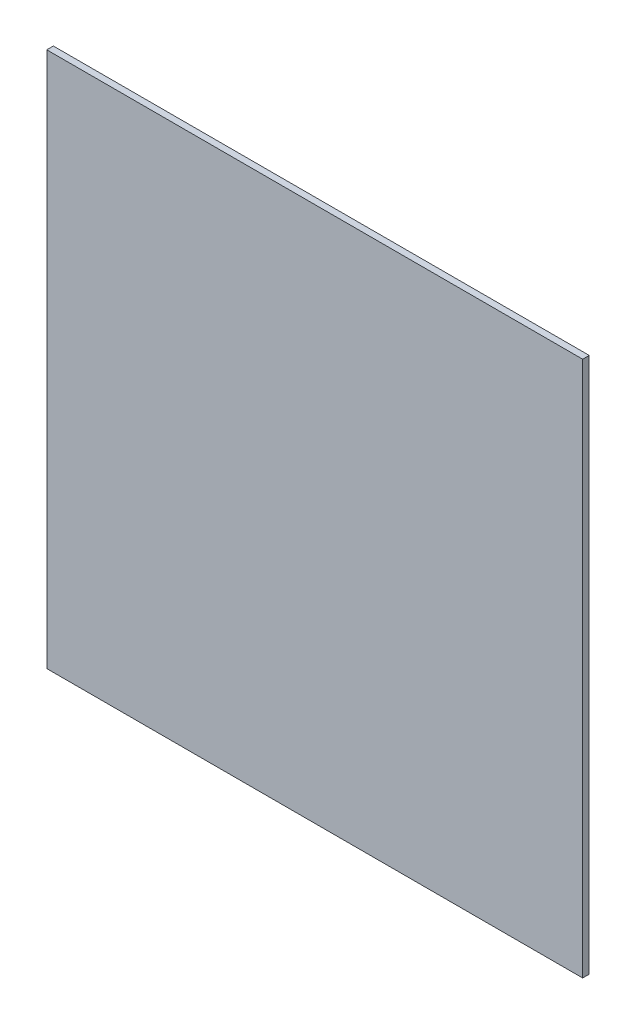
ISO-10303-21;
HEADER;
FILE_DESCRIPTION(('STEP AP214'),'2;1');
FILE_NAME('part.step','',(''),(''),'','','');
FILE_SCHEMA(('AUTOMOTIVE_DESIGN { 1 0 10303 214 1 1 1 1 }'));
ENDSEC;
DATA;
#1=APPLICATION_CONTEXT('core data for automotive mechanical design processes');
#2=APPLICATION_PROTOCOL_DEFINITION('international standard','automotive_design',2000,#1);
#3=PRODUCT_CONTEXT('',#1,'mechanical');
#4=PRODUCT('Part','Part','',(#3));
#5=PRODUCT_RELATED_PRODUCT_CATEGORY('part','',(#4));
#6=PRODUCT_DEFINITION_FORMATION('','',#4);
#7=PRODUCT_DEFINITION_CONTEXT('part definition',#1,'design');
#8=PRODUCT_DEFINITION('design','',#6,#7);
#9=PRODUCT_DEFINITION_SHAPE('','',#8);
#10=(LENGTH_UNIT() NAMED_UNIT(*) SI_UNIT(.MILLI.,.METRE.));
#11=(NAMED_UNIT(*) PLANE_ANGLE_UNIT() SI_UNIT($,.RADIAN.));
#12=(NAMED_UNIT(*) SI_UNIT($,.STERADIAN.) SOLID_ANGLE_UNIT());
#13=UNCERTAINTY_MEASURE_WITH_UNIT(LENGTH_MEASURE(1.E-05),#10,'distance_accuracy_value','');
#14=(GEOMETRIC_REPRESENTATION_CONTEXT(3) GLOBAL_UNCERTAINTY_ASSIGNED_CONTEXT((#13)) GLOBAL_UNIT_ASSIGNED_CONTEXT((#10,
#11,#12)) REPRESENTATION_CONTEXT('',''));
#15=CARTESIAN_POINT('',(0.,0.,0.));
#16=DIRECTION('',(0.,0.,1.));
#17=DIRECTION('',(1.,0.,0.));
#18=AXIS2_PLACEMENT_3D('',#15,#16,#17);
#19=CARTESIAN_POINT('',(0.,0.,8.73125));
#20=DIRECTION('',(1.,0.,0.));
#21=DIRECTION('',(0.,0.,-1.));
#22=AXIS2_PLACEMENT_3D('',#19,#20,#21);
#23=PLANE('',#22);
#24=DIRECTION('',(0.,-1.,0.));
#25=VECTOR('',#24,1.);
#26=CARTESIAN_POINT('',(0.,0.,0.));
#27=LINE('',#26,#25);
#28=CARTESIAN_POINT('',(0.,711.2,0.));
#29=VERTEX_POINT('',#28);
#30=CARTESIAN_POINT('',(0.,0.,0.));
#31=VERTEX_POINT('',#30);
#32=EDGE_CURVE('E97',#29,#31,#27,.T.);
#33=ORIENTED_EDGE('',*,*,#32,.T.);
#34=DIRECTION('',(0.,0.,-1.));
#35=VECTOR('',#34,1.);
#36=CARTESIAN_POINT('',(0.,0.,8.73125));
#37=LINE('',#36,#35);
#38=CARTESIAN_POINT('',(0.,0.,8.73125));
#39=VERTEX_POINT('',#38);
#40=EDGE_CURVE('E11',#39,#31,#37,.T.);
#41=ORIENTED_EDGE('',*,*,#40,.F.);
#42=DIRECTION('',(0.,-1.,0.));
#43=VECTOR('',#42,1.);
#44=CARTESIAN_POINT('',(0.,0.,8.73125));
#45=LINE('',#44,#43);
#46=CARTESIAN_POINT('',(0.,711.2,8.73125));
#47=VERTEX_POINT('',#46);
#48=EDGE_CURVE('E85',#47,#39,#45,.T.);
#49=ORIENTED_EDGE('',*,*,#48,.F.);
#50=DIRECTION('',(0.,0.,-1.));
#51=VECTOR('',#50,1.);
#52=CARTESIAN_POINT('',(0.,711.2,8.73125));
#53=LINE('',#52,#51);
#54=EDGE_CURVE('E93',#47,#29,#53,.T.);
#55=ORIENTED_EDGE('',*,*,#54,.T.);
#56=EDGE_LOOP('',(#33,#41,#49,#55));
#57=FACE_BOUND('',#56,.T.);
#58=ADVANCED_FACE('F34',(#57),#23,.F.);
#59=CARTESIAN_POINT('',(0.,0.,8.73125));
#60=DIRECTION('',(0.,1.,0.));
#61=DIRECTION('',(0.,0.,1.));
#62=AXIS2_PLACEMENT_3D('',#59,#60,#61);
#63=PLANE('',#62);
#64=DIRECTION('',(1.,0.,0.));
#65=VECTOR('',#64,1.);
#66=CARTESIAN_POINT('',(0.,0.,0.));
#67=LINE('',#66,#65);
#68=CARTESIAN_POINT('',(711.2,0.,0.));
#69=VERTEX_POINT('',#68);
#70=EDGE_CURVE('E89',#31,#69,#67,.T.);
#71=ORIENTED_EDGE('',*,*,#70,.T.);
#72=DIRECTION('',(0.,0.,-1.));
#73=VECTOR('',#72,1.);
#74=CARTESIAN_POINT('',(711.2,0.,8.73125));
#75=LINE('',#74,#73);
#76=CARTESIAN_POINT('',(711.2,0.,8.73125));
#77=VERTEX_POINT('',#76);
#78=EDGE_CURVE('E42',#77,#69,#75,.T.);
#79=ORIENTED_EDGE('',*,*,#78,.F.);
#80=DIRECTION('',(1.,0.,0.));
#81=VECTOR('',#80,1.);
#82=CARTESIAN_POINT('',(0.,0.,8.73125));
#83=LINE('',#82,#81);
#84=EDGE_CURVE('E80',#39,#77,#83,.T.);
#85=ORIENTED_EDGE('',*,*,#84,.F.);
#86=ORIENTED_EDGE('',*,*,#40,.T.);
#87=EDGE_LOOP('',(#71,#79,#85,#86));
#88=FACE_BOUND('',#87,.T.);
#89=ADVANCED_FACE('F88',(#88),#63,.F.);
#90=CARTESIAN_POINT('',(711.2,0.,8.73125));
#91=DIRECTION('',(-1.,0.,0.));
#92=DIRECTION('',(0.,0.,1.));
#93=AXIS2_PLACEMENT_3D('',#90,#91,#92);
#94=PLANE('',#93);
#95=DIRECTION('',(0.,1.,0.));
#96=VECTOR('',#95,1.);
#97=CARTESIAN_POINT('',(711.2,0.,0.));
#98=LINE('',#97,#96);
#99=CARTESIAN_POINT('',(711.2,711.2,0.));
#100=VERTEX_POINT('',#99);
#101=EDGE_CURVE('E67',#69,#100,#98,.T.);
#102=ORIENTED_EDGE('',*,*,#101,.T.);
#103=DIRECTION('',(0.,0.,-1.));
#104=VECTOR('',#103,1.);
#105=CARTESIAN_POINT('',(711.2,711.2,8.73125));
#106=LINE('',#105,#104);
#107=CARTESIAN_POINT('',(711.2,711.2,8.73125));
#108=VERTEX_POINT('',#107);
#109=EDGE_CURVE('E90',#108,#100,#106,.T.);
#110=ORIENTED_EDGE('',*,*,#109,.F.);
#111=DIRECTION('',(0.,1.,0.));
#112=VECTOR('',#111,1.);
#113=CARTESIAN_POINT('',(711.2,0.,8.73125));
#114=LINE('',#113,#112);
#115=EDGE_CURVE('E83',#77,#108,#114,.T.);
#116=ORIENTED_EDGE('',*,*,#115,.F.);
#117=ORIENTED_EDGE('',*,*,#78,.T.);
#118=EDGE_LOOP('',(#102,#110,#116,#117));
#119=FACE_BOUND('',#118,.T.);
#120=ADVANCED_FACE('F91',(#119),#94,.F.);
#121=CARTESIAN_POINT('',(0.,711.2,8.73125));
#122=DIRECTION('',(0.,-1.,0.));
#123=DIRECTION('',(0.,0.,-1.));
#124=AXIS2_PLACEMENT_3D('',#121,#122,#123);
#125=PLANE('',#124);
#126=DIRECTION('',(-1.,0.,0.));
#127=VECTOR('',#126,1.);
#128=CARTESIAN_POINT('',(0.,711.2,0.));
#129=LINE('',#128,#127);
#130=EDGE_CURVE('E73',#100,#29,#129,.T.);
#131=ORIENTED_EDGE('',*,*,#130,.T.);
#132=ORIENTED_EDGE('',*,*,#54,.F.);
#133=DIRECTION('',(-1.,0.,0.));
#134=VECTOR('',#133,1.);
#135=CARTESIAN_POINT('',(0.,711.2,8.73125));
#136=LINE('',#135,#134);
#137=EDGE_CURVE('E50',#108,#47,#136,.T.);
#138=ORIENTED_EDGE('',*,*,#137,.F.);
#139=ORIENTED_EDGE('',*,*,#109,.T.);
#140=EDGE_LOOP('',(#131,#132,#138,#139));
#141=FACE_BOUND('',#140,.T.);
#142=ADVANCED_FACE('F104',(#141),#125,.F.);
#143=CARTESIAN_POINT('',(0.,0.,8.73125));
#144=DIRECTION('',(0.,0.,-1.));
#145=DIRECTION('',(-1.,0.,0.));
#146=AXIS2_PLACEMENT_3D('',#143,#144,#145);
#147=PLANE('',#146);
#148=ORIENTED_EDGE('',*,*,#48,.T.);
#149=ORIENTED_EDGE('',*,*,#84,.T.);
#150=ORIENTED_EDGE('',*,*,#115,.T.);
#151=ORIENTED_EDGE('',*,*,#137,.T.);
#152=EDGE_LOOP('',(#148,#149,#150,#151));
#153=FACE_BOUND('',#152,.T.);
#154=ADVANCED_FACE('F81',(#153),#147,.F.);
#155=CARTESIAN_POINT('',(0.,0.,0.));
#156=DIRECTION('',(0.,0.,-1.));
#157=DIRECTION('',(-1.,0.,0.));
#158=AXIS2_PLACEMENT_3D('',#155,#156,#157);
#159=PLANE('',#158);
#160=ORIENTED_EDGE('',*,*,#32,.F.);
#161=ORIENTED_EDGE('',*,*,#130,.F.);
#162=ORIENTED_EDGE('',*,*,#101,.F.);
#163=ORIENTED_EDGE('',*,*,#70,.F.);
#164=EDGE_LOOP('',(#160,#161,#162,#163));
#165=FACE_BOUND('',#164,.T.);
#166=ADVANCED_FACE('F107',(#165),#159,.T.);
#167=CLOSED_SHELL('',(#58,#89,#120,#142,#154,#166));
#168=MANIFOLD_SOLID_BREP('B2',#167);
#169=ADVANCED_BREP_SHAPE_REPRESENTATION('',(#18,#168),#14);
#170=SHAPE_DEFINITION_REPRESENTATION(#9,#169);
ENDSEC;
END-ISO-10303-21;
